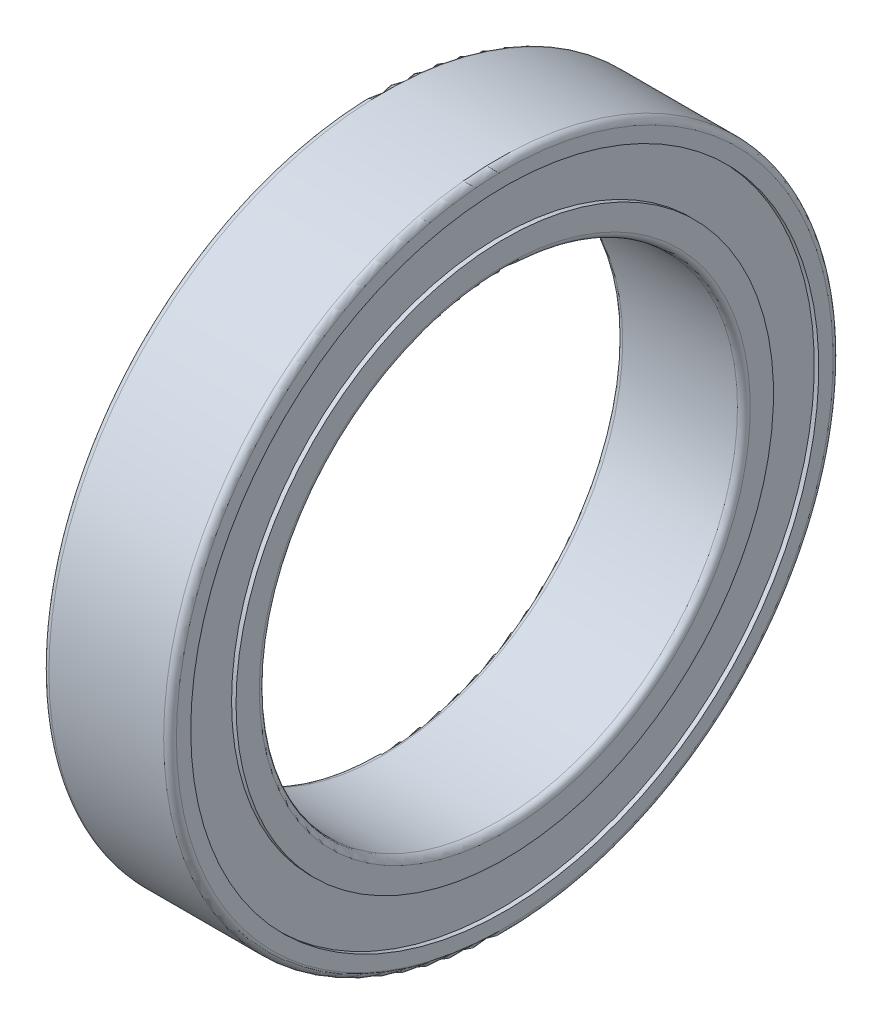
ISO-10303-21;
HEADER;
FILE_DESCRIPTION(('STEP AP214'),'2;1');
FILE_NAME('part.step','',(''),(''),'','','');
FILE_SCHEMA(('AUTOMOTIVE_DESIGN { 1 0 10303 214 1 1 1 1 }'));
ENDSEC;
DATA;
#1=APPLICATION_CONTEXT('core data for automotive mechanical design processes');
#2=APPLICATION_PROTOCOL_DEFINITION('international standard','automotive_design',2000,#1);
#3=PRODUCT_CONTEXT('',#1,'mechanical');
#4=PRODUCT('Part','Part','',(#3));
#5=PRODUCT_RELATED_PRODUCT_CATEGORY('part','',(#4));
#6=PRODUCT_DEFINITION_FORMATION('','',#4);
#7=PRODUCT_DEFINITION_CONTEXT('part definition',#1,'design');
#8=PRODUCT_DEFINITION('design','',#6,#7);
#9=PRODUCT_DEFINITION_SHAPE('','',#8);
#10=(LENGTH_UNIT() NAMED_UNIT(*) SI_UNIT(.MILLI.,.METRE.));
#11=(NAMED_UNIT(*) PLANE_ANGLE_UNIT() SI_UNIT($,.RADIAN.));
#12=(NAMED_UNIT(*) SI_UNIT($,.STERADIAN.) SOLID_ANGLE_UNIT());
#13=UNCERTAINTY_MEASURE_WITH_UNIT(LENGTH_MEASURE(1.E-05),#10,'distance_accuracy_value','');
#14=(GEOMETRIC_REPRESENTATION_CONTEXT(3) GLOBAL_UNCERTAINTY_ASSIGNED_CONTEXT((#13)) GLOBAL_UNIT_ASSIGNED_CONTEXT((#10,
#11,#12)) REPRESENTATION_CONTEXT('',''));
#15=CARTESIAN_POINT('',(0.,0.,0.));
#16=DIRECTION('',(0.,0.,1.));
#17=DIRECTION('',(1.,0.,0.));
#18=AXIS2_PLACEMENT_3D('',#15,#16,#17);
#19=CARTESIAN_POINT('',(0.,10.5,0.));
#20=DIRECTION('',(1.,0.,0.));
#21=DIRECTION('',(0.,0.,-1.));
#22=AXIS2_PLACEMENT_3D('',#19,#20,#21);
#23=PLANE('',#22);
#24=CARTESIAN_POINT('',(0.,0.,0.));
#25=DIRECTION('',(1.,0.,0.));
#26=DIRECTION('',(0.,0.,-1.));
#27=AXIS2_PLACEMENT_3D('',#24,#25,#26);
#28=CIRCLE('',#27,10.3);
#29=CARTESIAN_POINT('',(0.,0.,-10.3));
#30=VERTEX_POINT('',#29);
#31=EDGE_CURVE('E63',#30,#30,#28,.F.);
#32=ORIENTED_EDGE('',*,*,#31,.T.);
#33=EDGE_LOOP('',(#32));
#34=FACE_BOUND('',#33,.T.);
#35=CARTESIAN_POINT('',(0.,0.,0.));
#36=DIRECTION('',(-1.,0.,0.));
#37=DIRECTION('',(0.,0.,1.));
#38=AXIS2_PLACEMENT_3D('',#35,#36,#37);
#39=CIRCLE('',#38,9.85);
#40=CARTESIAN_POINT('',(0.,0.,9.85));
#41=VERTEX_POINT('',#40);
#42=EDGE_CURVE('E75',#41,#41,#39,.T.);
#43=ORIENTED_EDGE('',*,*,#42,.F.);
#44=EDGE_LOOP('',(#43));
#45=FACE_BOUND('',#44,.T.);
#46=ADVANCED_FACE('F43',(#34,#45),#23,.F.);
#47=CARTESIAN_POINT('',(0.,0.,0.));
#48=DIRECTION('',(-1.,0.,0.));
#49=DIRECTION('',(0.,0.,1.));
#50=AXIS2_PLACEMENT_3D('',#47,#48,#49);
#51=CYLINDRICAL_SURFACE('',#50,9.85);
#52=CARTESIAN_POINT('',(0.14,0.,0.));
#53=DIRECTION('',(-1.,0.,0.));
#54=DIRECTION('',(0.,0.,1.));
#55=AXIS2_PLACEMENT_3D('',#52,#53,#54);
#56=CIRCLE('',#55,9.85);
#57=CARTESIAN_POINT('',(0.14,0.,9.85));
#58=VERTEX_POINT('',#57);
#59=EDGE_CURVE('E78',#58,#58,#56,.T.);
#60=ORIENTED_EDGE('',*,*,#59,.F.);
#61=EDGE_LOOP('',(#60));
#62=FACE_BOUND('',#61,.T.);
#63=ORIENTED_EDGE('',*,*,#42,.T.);
#64=EDGE_LOOP('',(#63));
#65=FACE_BOUND('',#64,.T.);
#66=ADVANCED_FACE('F131',(#62,#65),#51,.F.);
#67=CARTESIAN_POINT('',(0.14,9.85,0.));
#68=DIRECTION('',(1.,0.,0.));
#69=DIRECTION('',(0.,0.,-1.));
#70=AXIS2_PLACEMENT_3D('',#67,#68,#69);
#71=PLANE('',#70);
#72=CARTESIAN_POINT('',(0.14,0.,0.));
#73=DIRECTION('',(-1.,0.,0.));
#74=DIRECTION('',(0.,0.,1.));
#75=AXIS2_PLACEMENT_3D('',#72,#73,#74);
#76=CIRCLE('',#75,8.43);
#77=CARTESIAN_POINT('',(0.14,0.,8.43));
#78=VERTEX_POINT('',#77);
#79=EDGE_CURVE('E81',#78,#78,#76,.T.);
#80=ORIENTED_EDGE('',*,*,#79,.F.);
#81=EDGE_LOOP('',(#80));
#82=FACE_BOUND('',#81,.T.);
#83=ORIENTED_EDGE('',*,*,#59,.T.);
#84=EDGE_LOOP('',(#83));
#85=FACE_BOUND('',#84,.T.);
#86=ADVANCED_FACE('F137',(#82,#85),#71,.F.);
#87=CARTESIAN_POINT('',(0.,0.,0.));
#88=DIRECTION('',(-1.,0.,0.));
#89=DIRECTION('',(0.,0.,1.));
#90=AXIS2_PLACEMENT_3D('',#87,#88,#89);
#91=CYLINDRICAL_SURFACE('',#90,8.43);
#92=CARTESIAN_POINT('',(0.,0.,0.));
#93=DIRECTION('',(-1.,0.,0.));
#94=DIRECTION('',(0.,0.,1.));
#95=AXIS2_PLACEMENT_3D('',#92,#93,#94);
#96=CIRCLE('',#95,8.43);
#97=CARTESIAN_POINT('',(0.,0.,8.43));
#98=VERTEX_POINT('',#97);
#99=EDGE_CURVE('E84',#98,#98,#96,.T.);
#100=ORIENTED_EDGE('',*,*,#99,.F.);
#101=EDGE_LOOP('',(#100));
#102=FACE_BOUND('',#101,.T.);
#103=ORIENTED_EDGE('',*,*,#79,.T.);
#104=EDGE_LOOP('',(#103));
#105=FACE_BOUND('',#104,.T.);
#106=ADVANCED_FACE('F190',(#102,#105),#91,.T.);
#107=CARTESIAN_POINT('',(0.,8.43,0.));
#108=DIRECTION('',(1.,0.,0.));
#109=DIRECTION('',(0.,0.,-1.));
#110=AXIS2_PLACEMENT_3D('',#107,#108,#109);
#111=PLANE('',#110);
#112=CARTESIAN_POINT('',(0.,0.,0.));
#113=DIRECTION('',(1.,0.,0.));
#114=DIRECTION('',(0.,0.,-1.));
#115=AXIS2_PLACEMENT_3D('',#112,#113,#114);
#116=CIRCLE('',#115,7.7);
#117=CARTESIAN_POINT('',(0.,0.,-7.7));
#118=VERTEX_POINT('',#117);
#119=EDGE_CURVE('E12',#118,#118,#116,.T.);
#120=ORIENTED_EDGE('',*,*,#119,.T.);
#121=EDGE_LOOP('',(#120));
#122=FACE_BOUND('',#121,.T.);
#123=ORIENTED_EDGE('',*,*,#99,.T.);
#124=EDGE_LOOP('',(#123));
#125=FACE_BOUND('',#124,.T.);
#126=ADVANCED_FACE('F128',(#122,#125),#111,.F.);
#127=CARTESIAN_POINT('',(0.,0.,0.));
#128=DIRECTION('',(-1.,0.,0.));
#129=DIRECTION('',(0.,0.,1.));
#130=AXIS2_PLACEMENT_3D('',#127,#128,#129);
#131=CYLINDRICAL_SURFACE('',#130,7.5);
#132=CARTESIAN_POINT('',(3.8,0.,0.));
#133=DIRECTION('',(-1.,0.,0.));
#134=DIRECTION('',(0.,0.,1.));
#135=AXIS2_PLACEMENT_3D('',#132,#133,#134);
#136=CIRCLE('',#135,7.5);
#137=CARTESIAN_POINT('',(3.8,0.,7.5));
#138=VERTEX_POINT('',#137);
#139=EDGE_CURVE('E50',#138,#138,#136,.F.);
#140=ORIENTED_EDGE('',*,*,#139,.T.);
#141=EDGE_LOOP('',(#140));
#142=FACE_BOUND('',#141,.T.);
#143=CARTESIAN_POINT('',(0.2,0.,0.));
#144=DIRECTION('',(1.,0.,0.));
#145=DIRECTION('',(0.,0.,-1.));
#146=AXIS2_PLACEMENT_3D('',#143,#144,#145);
#147=CIRCLE('',#146,7.5);
#148=CARTESIAN_POINT('',(0.2,0.,-7.5));
#149=VERTEX_POINT('',#148);
#150=EDGE_CURVE('E54',#149,#149,#147,.F.);
#151=ORIENTED_EDGE('',*,*,#150,.T.);
#152=EDGE_LOOP('',(#151));
#153=FACE_BOUND('',#152,.T.);
#154=ADVANCED_FACE('F122',(#142,#153),#131,.F.);
#155=CARTESIAN_POINT('',(4.,8.43,0.));
#156=DIRECTION('',(-1.,0.,0.));
#157=DIRECTION('',(0.,0.,1.));
#158=AXIS2_PLACEMENT_3D('',#155,#156,#157);
#159=PLANE('',#158);
#160=CARTESIAN_POINT('',(4.,0.,0.));
#161=DIRECTION('',(-1.,0.,0.));
#162=DIRECTION('',(0.,0.,1.));
#163=AXIS2_PLACEMENT_3D('',#160,#161,#162);
#164=CIRCLE('',#163,7.7);
#165=CARTESIAN_POINT('',(4.,0.,7.7));
#166=VERTEX_POINT('',#165);
#167=EDGE_CURVE('E58',#166,#166,#164,.T.);
#168=ORIENTED_EDGE('',*,*,#167,.T.);
#169=EDGE_LOOP('',(#168));
#170=FACE_BOUND('',#169,.T.);
#171=CARTESIAN_POINT('',(4.,0.,0.));
#172=DIRECTION('',(-1.,0.,0.));
#173=DIRECTION('',(0.,0.,1.));
#174=AXIS2_PLACEMENT_3D('',#171,#172,#173);
#175=CIRCLE('',#174,8.43);
#176=CARTESIAN_POINT('',(4.,0.,8.43));
#177=VERTEX_POINT('',#176);
#178=EDGE_CURVE('E87',#177,#177,#175,.T.);
#179=ORIENTED_EDGE('',*,*,#178,.F.);
#180=EDGE_LOOP('',(#179));
#181=FACE_BOUND('',#180,.T.);
#182=ADVANCED_FACE('F117',(#170,#181),#159,.F.);
#183=CARTESIAN_POINT('',(0.,0.,0.));
#184=DIRECTION('',(-1.,0.,0.));
#185=DIRECTION('',(0.,0.,1.));
#186=AXIS2_PLACEMENT_3D('',#183,#184,#185);
#187=CYLINDRICAL_SURFACE('',#186,8.43);
#188=CARTESIAN_POINT('',(3.86,0.,0.));
#189=DIRECTION('',(-1.,0.,0.));
#190=DIRECTION('',(0.,0.,1.));
#191=AXIS2_PLACEMENT_3D('',#188,#189,#190);
#192=CIRCLE('',#191,8.43);
#193=CARTESIAN_POINT('',(3.86,0.,8.43));
#194=VERTEX_POINT('',#193);
#195=EDGE_CURVE('E90',#194,#194,#192,.T.);
#196=ORIENTED_EDGE('',*,*,#195,.F.);
#197=EDGE_LOOP('',(#196));
#198=FACE_BOUND('',#197,.T.);
#199=ORIENTED_EDGE('',*,*,#178,.T.);
#200=EDGE_LOOP('',(#199));
#201=FACE_BOUND('',#200,.T.);
#202=ADVANCED_FACE('F111',(#198,#201),#187,.T.);
#203=CARTESIAN_POINT('',(3.86,9.85,0.));
#204=DIRECTION('',(-1.,0.,0.));
#205=DIRECTION('',(0.,0.,1.));
#206=AXIS2_PLACEMENT_3D('',#203,#204,#205);
#207=PLANE('',#206);
#208=CARTESIAN_POINT('',(3.86,0.,0.));
#209=DIRECTION('',(-1.,0.,0.));
#210=DIRECTION('',(0.,0.,1.));
#211=AXIS2_PLACEMENT_3D('',#208,#209,#210);
#212=CIRCLE('',#211,9.85);
#213=CARTESIAN_POINT('',(3.86,0.,9.85));
#214=VERTEX_POINT('',#213);
#215=EDGE_CURVE('E93',#214,#214,#212,.T.);
#216=ORIENTED_EDGE('',*,*,#215,.F.);
#217=EDGE_LOOP('',(#216));
#218=FACE_BOUND('',#217,.T.);
#219=ORIENTED_EDGE('',*,*,#195,.T.);
#220=EDGE_LOOP('',(#219));
#221=FACE_BOUND('',#220,.T.);
#222=ADVANCED_FACE('F105',(#218,#221),#207,.F.);
#223=CARTESIAN_POINT('',(0.,0.,0.));
#224=DIRECTION('',(-1.,0.,0.));
#225=DIRECTION('',(0.,0.,1.));
#226=AXIS2_PLACEMENT_3D('',#223,#224,#225);
#227=CYLINDRICAL_SURFACE('',#226,9.85);
#228=CARTESIAN_POINT('',(4.,0.,0.));
#229=DIRECTION('',(-1.,0.,0.));
#230=DIRECTION('',(0.,0.,1.));
#231=AXIS2_PLACEMENT_3D('',#228,#229,#230);
#232=CIRCLE('',#231,9.85);
#233=CARTESIAN_POINT('',(4.,0.,9.85));
#234=VERTEX_POINT('',#233);
#235=EDGE_CURVE('E96',#234,#234,#232,.T.);
#236=ORIENTED_EDGE('',*,*,#235,.F.);
#237=EDGE_LOOP('',(#236));
#238=FACE_BOUND('',#237,.T.);
#239=ORIENTED_EDGE('',*,*,#215,.T.);
#240=EDGE_LOOP('',(#239));
#241=FACE_BOUND('',#240,.T.);
#242=ADVANCED_FACE('F102',(#238,#241),#227,.F.);
#243=CARTESIAN_POINT('',(4.,10.5,0.));
#244=DIRECTION('',(-1.,0.,0.));
#245=DIRECTION('',(0.,0.,1.));
#246=AXIS2_PLACEMENT_3D('',#243,#244,#245);
#247=PLANE('',#246);
#248=CARTESIAN_POINT('',(4.,0.,0.));
#249=DIRECTION('',(-1.,0.,0.));
#250=DIRECTION('',(0.,0.,1.));
#251=AXIS2_PLACEMENT_3D('',#248,#249,#250);
#252=CIRCLE('',#251,10.3);
#253=CARTESIAN_POINT('',(4.,0.,10.3));
#254=VERTEX_POINT('',#253);
#255=EDGE_CURVE('E66',#254,#254,#252,.F.);
#256=ORIENTED_EDGE('',*,*,#255,.T.);
#257=EDGE_LOOP('',(#256));
#258=FACE_BOUND('',#257,.T.);
#259=ORIENTED_EDGE('',*,*,#235,.T.);
#260=EDGE_LOOP('',(#259));
#261=FACE_BOUND('',#260,.T.);
#262=ADVANCED_FACE('F100',(#258,#261),#247,.F.);
#263=CARTESIAN_POINT('',(0.,0.,0.));
#264=DIRECTION('',(-1.,0.,0.));
#265=DIRECTION('',(0.,0.,1.));
#266=AXIS2_PLACEMENT_3D('',#263,#264,#265);
#267=CYLINDRICAL_SURFACE('',#266,10.5);
#268=CARTESIAN_POINT('',(3.8,0.,0.));
#269=DIRECTION('',(-1.,0.,0.));
#270=DIRECTION('',(0.,0.,1.));
#271=AXIS2_PLACEMENT_3D('',#268,#269,#270);
#272=CIRCLE('',#271,10.5);
#273=CARTESIAN_POINT('',(3.8,0.,10.5));
#274=VERTEX_POINT('',#273);
#275=EDGE_CURVE('E69',#274,#274,#272,.T.);
#276=ORIENTED_EDGE('',*,*,#275,.T.);
#277=EDGE_LOOP('',(#276));
#278=FACE_BOUND('',#277,.T.);
#279=CARTESIAN_POINT('',(0.2,0.,0.));
#280=DIRECTION('',(1.,0.,0.));
#281=DIRECTION('',(0.,0.,-1.));
#282=AXIS2_PLACEMENT_3D('',#279,#280,#281);
#283=CIRCLE('',#282,10.5);
#284=CARTESIAN_POINT('',(0.2,0.,-10.5));
#285=VERTEX_POINT('',#284);
#286=EDGE_CURVE('E72',#285,#285,#283,.T.);
#287=ORIENTED_EDGE('',*,*,#286,.T.);
#288=EDGE_LOOP('',(#287));
#289=FACE_BOUND('',#288,.T.);
#290=ADVANCED_FACE('F147',(#278,#289),#267,.T.);
#291=CARTESIAN_POINT('',(3.8,0.,0.));
#292=DIRECTION('',(-1.,0.,0.));
#293=DIRECTION('',(0.,0.,1.));
#294=AXIS2_PLACEMENT_3D('',#291,#292,#293);
#295=TOROIDAL_SURFACE('',#294,10.3,0.2);
#296=ORIENTED_EDGE('',*,*,#255,.F.);
#297=EDGE_LOOP('',(#296));
#298=FACE_BOUND('',#297,.T.);
#299=ORIENTED_EDGE('',*,*,#275,.F.);
#300=EDGE_LOOP('',(#299));
#301=FACE_BOUND('',#300,.T.);
#302=ADVANCED_FACE('F143',(#298,#301),#295,.T.);
#303=CARTESIAN_POINT('',(0.2,0.,0.));
#304=DIRECTION('',(1.,0.,0.));
#305=DIRECTION('',(0.,0.,-1.));
#306=AXIS2_PLACEMENT_3D('',#303,#304,#305);
#307=TOROIDAL_SURFACE('',#306,10.3,0.2);
#308=ORIENTED_EDGE('',*,*,#286,.F.);
#309=EDGE_LOOP('',(#308));
#310=FACE_BOUND('',#309,.T.);
#311=ORIENTED_EDGE('',*,*,#31,.F.);
#312=EDGE_LOOP('',(#311));
#313=FACE_BOUND('',#312,.T.);
#314=ADVANCED_FACE('F146',(#310,#313),#307,.T.);
#315=CARTESIAN_POINT('',(3.8,0.,0.));
#316=DIRECTION('',(-1.,0.,0.));
#317=DIRECTION('',(0.,0.,1.));
#318=AXIS2_PLACEMENT_3D('',#315,#316,#317);
#319=TOROIDAL_SURFACE('',#318,7.7,0.2);
#320=ORIENTED_EDGE('',*,*,#139,.F.);
#321=EDGE_LOOP('',(#320));
#322=FACE_BOUND('',#321,.T.);
#323=ORIENTED_EDGE('',*,*,#167,.F.);
#324=EDGE_LOOP('',(#323));
#325=FACE_BOUND('',#324,.T.);
#326=ADVANCED_FACE('F150',(#322,#325),#319,.T.);
#327=CARTESIAN_POINT('',(0.2,0.,0.));
#328=DIRECTION('',(1.,0.,0.));
#329=DIRECTION('',(0.,0.,-1.));
#330=AXIS2_PLACEMENT_3D('',#327,#328,#329);
#331=TOROIDAL_SURFACE('',#330,7.7,0.2);
#332=ORIENTED_EDGE('',*,*,#119,.F.);
#333=EDGE_LOOP('',(#332));
#334=FACE_BOUND('',#333,.T.);
#335=ORIENTED_EDGE('',*,*,#150,.F.);
#336=EDGE_LOOP('',(#335));
#337=FACE_BOUND('',#336,.T.);
#338=ADVANCED_FACE('F45',(#334,#337),#331,.T.);
#339=CLOSED_SHELL('',(#46,#66,#86,#106,#126,#154,#182,#202,#222,#242,#262,#290,#302,#314,#326,#338));
#340=MANIFOLD_SOLID_BREP('B2',#339);
#341=ADVANCED_BREP_SHAPE_REPRESENTATION('',(#18,#340),#14);
#342=SHAPE_DEFINITION_REPRESENTATION(#9,#341);
ENDSEC;
END-ISO-10303-21;
